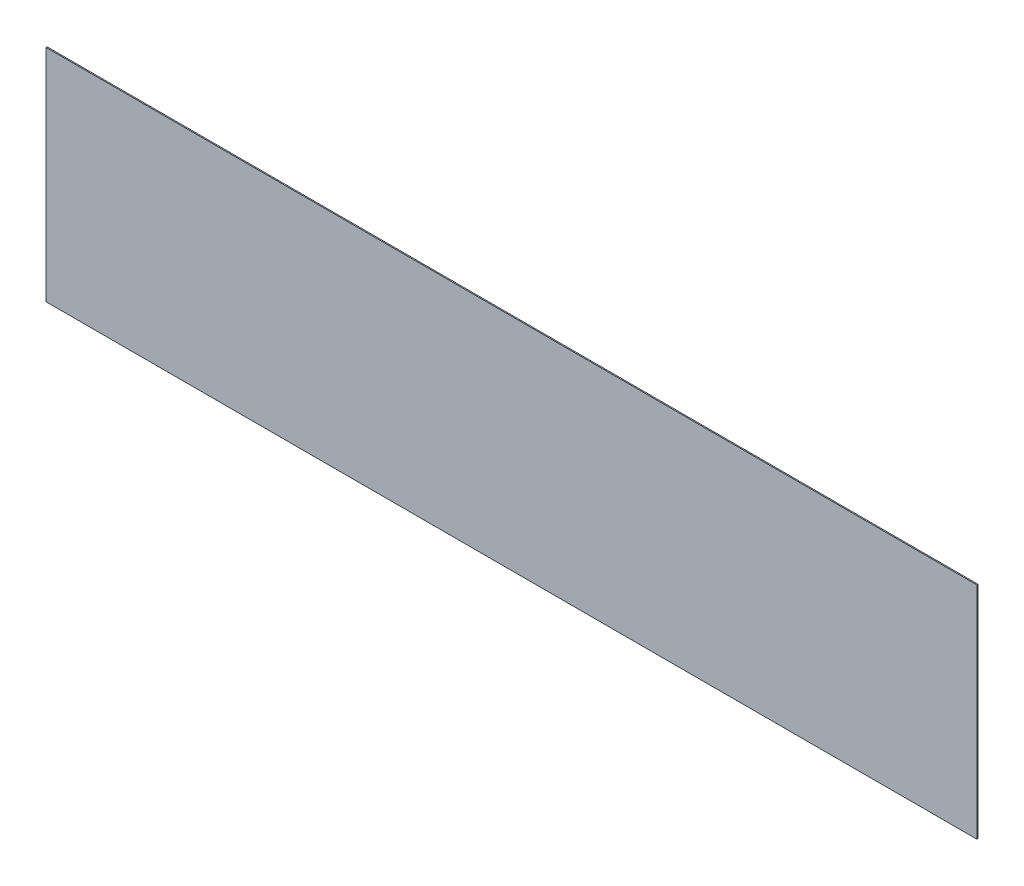
ISO-10303-21;
HEADER;
FILE_DESCRIPTION(('STEP AP214'),'2;1');
FILE_NAME('part.step','',(''),(''),'','','');
FILE_SCHEMA(('AUTOMOTIVE_DESIGN { 1 0 10303 214 1 1 1 1 }'));
ENDSEC;
DATA;
#1=APPLICATION_CONTEXT('core data for automotive mechanical design processes');
#2=APPLICATION_PROTOCOL_DEFINITION('international standard','automotive_design',2000,#1);
#3=PRODUCT_CONTEXT('',#1,'mechanical');
#4=PRODUCT('Part','Part','',(#3));
#5=PRODUCT_RELATED_PRODUCT_CATEGORY('part','',(#4));
#6=PRODUCT_DEFINITION_FORMATION('','',#4);
#7=PRODUCT_DEFINITION_CONTEXT('part definition',#1,'design');
#8=PRODUCT_DEFINITION('design','',#6,#7);
#9=PRODUCT_DEFINITION_SHAPE('','',#8);
#10=(LENGTH_UNIT() NAMED_UNIT(*) SI_UNIT(.MILLI.,.METRE.));
#11=(NAMED_UNIT(*) PLANE_ANGLE_UNIT() SI_UNIT($,.RADIAN.));
#12=(NAMED_UNIT(*) SI_UNIT($,.STERADIAN.) SOLID_ANGLE_UNIT());
#13=UNCERTAINTY_MEASURE_WITH_UNIT(LENGTH_MEASURE(1.E-05),#10,'distance_accuracy_value','');
#14=(GEOMETRIC_REPRESENTATION_CONTEXT(3) GLOBAL_UNCERTAINTY_ASSIGNED_CONTEXT((#13)) GLOBAL_UNIT_ASSIGNED_CONTEXT((#10,
#11,#12)) REPRESENTATION_CONTEXT('',''));
#15=CARTESIAN_POINT('',(0.,0.,0.));
#16=DIRECTION('',(0.,0.,1.));
#17=DIRECTION('',(1.,0.,0.));
#18=AXIS2_PLACEMENT_3D('',#15,#16,#17);
#19=CARTESIAN_POINT('',(66.,1670.,40.));
#20=DIRECTION('',(1.,0.,0.));
#21=DIRECTION('',(0.,0.,-1.));
#22=AXIS2_PLACEMENT_3D('',#19,#20,#21);
#23=PLANE('',#22);
#24=DIRECTION('',(0.,-1.,0.));
#25=VECTOR('',#24,1.);
#26=CARTESIAN_POINT('',(66.,1670.,38.5));
#27=LINE('',#26,#25);
#28=CARTESIAN_POINT('',(66.,1970.,38.5));
#29=VERTEX_POINT('',#28);
#30=CARTESIAN_POINT('',(66.,1670.,38.5));
#31=VERTEX_POINT('',#30);
#32=EDGE_CURVE('E102',#29,#31,#27,.T.);
#33=ORIENTED_EDGE('',*,*,#32,.T.);
#34=DIRECTION('',(0.,0.,-1.));
#35=VECTOR('',#34,1.);
#36=CARTESIAN_POINT('',(66.,1670.,40.));
#37=LINE('',#36,#35);
#38=CARTESIAN_POINT('',(66.,1670.,40.));
#39=VERTEX_POINT('',#38);
#40=EDGE_CURVE('E11',#39,#31,#37,.T.);
#41=ORIENTED_EDGE('',*,*,#40,.F.);
#42=DIRECTION('',(0.,-1.,0.));
#43=VECTOR('',#42,1.);
#44=CARTESIAN_POINT('',(66.,1670.,40.));
#45=LINE('',#44,#43);
#46=CARTESIAN_POINT('',(66.,1970.,40.));
#47=VERTEX_POINT('',#46);
#48=EDGE_CURVE('E90',#47,#39,#45,.T.);
#49=ORIENTED_EDGE('',*,*,#48,.F.);
#50=DIRECTION('',(0.,0.,-1.));
#51=VECTOR('',#50,1.);
#52=CARTESIAN_POINT('',(66.,1970.,40.));
#53=LINE('',#52,#51);
#54=EDGE_CURVE('E98',#47,#29,#53,.T.);
#55=ORIENTED_EDGE('',*,*,#54,.T.);
#56=EDGE_LOOP('',(#33,#41,#49,#55));
#57=FACE_BOUND('',#56,.T.);
#58=ADVANCED_FACE('F39',(#57),#23,.F.);
#59=CARTESIAN_POINT('',(66.,1670.,40.));
#60=DIRECTION('',(0.,1.,0.));
#61=DIRECTION('',(0.,0.,1.));
#62=AXIS2_PLACEMENT_3D('',#59,#60,#61);
#63=PLANE('',#62);
#64=DIRECTION('',(1.,0.,0.));
#65=VECTOR('',#64,1.);
#66=CARTESIAN_POINT('',(66.,1670.,38.5));
#67=LINE('',#66,#65);
#68=CARTESIAN_POINT('',(1334.,1670.,38.5));
#69=VERTEX_POINT('',#68);
#70=EDGE_CURVE('E94',#31,#69,#67,.T.);
#71=ORIENTED_EDGE('',*,*,#70,.T.);
#72=DIRECTION('',(0.,0.,-1.));
#73=VECTOR('',#72,1.);
#74=CARTESIAN_POINT('',(1334.,1670.,40.));
#75=LINE('',#74,#73);
#76=CARTESIAN_POINT('',(1334.,1670.,40.));
#77=VERTEX_POINT('',#76);
#78=EDGE_CURVE('E47',#77,#69,#75,.T.);
#79=ORIENTED_EDGE('',*,*,#78,.F.);
#80=DIRECTION('',(1.,0.,0.));
#81=VECTOR('',#80,1.);
#82=CARTESIAN_POINT('',(66.,1670.,40.));
#83=LINE('',#82,#81);
#84=EDGE_CURVE('E85',#39,#77,#83,.T.);
#85=ORIENTED_EDGE('',*,*,#84,.F.);
#86=ORIENTED_EDGE('',*,*,#40,.T.);
#87=EDGE_LOOP('',(#71,#79,#85,#86));
#88=FACE_BOUND('',#87,.T.);
#89=ADVANCED_FACE('F93',(#88),#63,.F.);
#90=CARTESIAN_POINT('',(1334.,1670.,40.));
#91=DIRECTION('',(-1.,0.,0.));
#92=DIRECTION('',(0.,0.,1.));
#93=AXIS2_PLACEMENT_3D('',#90,#91,#92);
#94=PLANE('',#93);
#95=DIRECTION('',(0.,1.,0.));
#96=VECTOR('',#95,1.);
#97=CARTESIAN_POINT('',(1334.,1670.,38.5));
#98=LINE('',#97,#96);
#99=CARTESIAN_POINT('',(1334.,1970.,38.5));
#100=VERTEX_POINT('',#99);
#101=EDGE_CURVE('E72',#69,#100,#98,.T.);
#102=ORIENTED_EDGE('',*,*,#101,.T.);
#103=DIRECTION('',(0.,0.,-1.));
#104=VECTOR('',#103,1.);
#105=CARTESIAN_POINT('',(1334.,1970.,40.));
#106=LINE('',#105,#104);
#107=CARTESIAN_POINT('',(1334.,1970.,40.));
#108=VERTEX_POINT('',#107);
#109=EDGE_CURVE('E95',#108,#100,#106,.T.);
#110=ORIENTED_EDGE('',*,*,#109,.F.);
#111=DIRECTION('',(0.,1.,0.));
#112=VECTOR('',#111,1.);
#113=CARTESIAN_POINT('',(1334.,1670.,40.));
#114=LINE('',#113,#112);
#115=EDGE_CURVE('E88',#77,#108,#114,.T.);
#116=ORIENTED_EDGE('',*,*,#115,.F.);
#117=ORIENTED_EDGE('',*,*,#78,.T.);
#118=EDGE_LOOP('',(#102,#110,#116,#117));
#119=FACE_BOUND('',#118,.T.);
#120=ADVANCED_FACE('F96',(#119),#94,.F.);
#121=CARTESIAN_POINT('',(66.,1970.,40.));
#122=DIRECTION('',(0.,-1.,0.));
#123=DIRECTION('',(0.,0.,-1.));
#124=AXIS2_PLACEMENT_3D('',#121,#122,#123);
#125=PLANE('',#124);
#126=DIRECTION('',(-1.,0.,0.));
#127=VECTOR('',#126,1.);
#128=CARTESIAN_POINT('',(66.,1970.,38.5));
#129=LINE('',#128,#127);
#130=EDGE_CURVE('E78',#100,#29,#129,.T.);
#131=ORIENTED_EDGE('',*,*,#130,.T.);
#132=ORIENTED_EDGE('',*,*,#54,.F.);
#133=DIRECTION('',(-1.,0.,0.));
#134=VECTOR('',#133,1.);
#135=CARTESIAN_POINT('',(66.,1970.,40.));
#136=LINE('',#135,#134);
#137=EDGE_CURVE('E55',#108,#47,#136,.T.);
#138=ORIENTED_EDGE('',*,*,#137,.F.);
#139=ORIENTED_EDGE('',*,*,#109,.T.);
#140=EDGE_LOOP('',(#131,#132,#138,#139));
#141=FACE_BOUND('',#140,.T.);
#142=ADVANCED_FACE('F109',(#141),#125,.F.);
#143=CARTESIAN_POINT('',(0.,0.,40.));
#144=DIRECTION('',(0.,0.,-1.));
#145=DIRECTION('',(-1.,0.,0.));
#146=AXIS2_PLACEMENT_3D('',#143,#144,#145);
#147=PLANE('',#146);
#148=ORIENTED_EDGE('',*,*,#48,.T.);
#149=ORIENTED_EDGE('',*,*,#84,.T.);
#150=ORIENTED_EDGE('',*,*,#115,.T.);
#151=ORIENTED_EDGE('',*,*,#137,.T.);
#152=EDGE_LOOP('',(#148,#149,#150,#151));
#153=FACE_BOUND('',#152,.T.);
#154=ADVANCED_FACE('F86',(#153),#147,.F.);
#155=CARTESIAN_POINT('',(0.,0.,38.5));
#156=DIRECTION('',(0.,0.,-1.));
#157=DIRECTION('',(-1.,0.,0.));
#158=AXIS2_PLACEMENT_3D('',#155,#156,#157);
#159=PLANE('',#158);
#160=ORIENTED_EDGE('',*,*,#32,.F.);
#161=ORIENTED_EDGE('',*,*,#130,.F.);
#162=ORIENTED_EDGE('',*,*,#101,.F.);
#163=ORIENTED_EDGE('',*,*,#70,.F.);
#164=EDGE_LOOP('',(#160,#161,#162,#163));
#165=FACE_BOUND('',#164,.T.);
#166=ADVANCED_FACE('F112',(#165),#159,.T.);
#167=CLOSED_SHELL('',(#58,#89,#120,#142,#154,#166));
#168=MANIFOLD_SOLID_BREP('B2',#167);
#169=ADVANCED_BREP_SHAPE_REPRESENTATION('',(#18,#168),#14);
#170=SHAPE_DEFINITION_REPRESENTATION(#9,#169);
ENDSEC;
END-ISO-10303-21;
